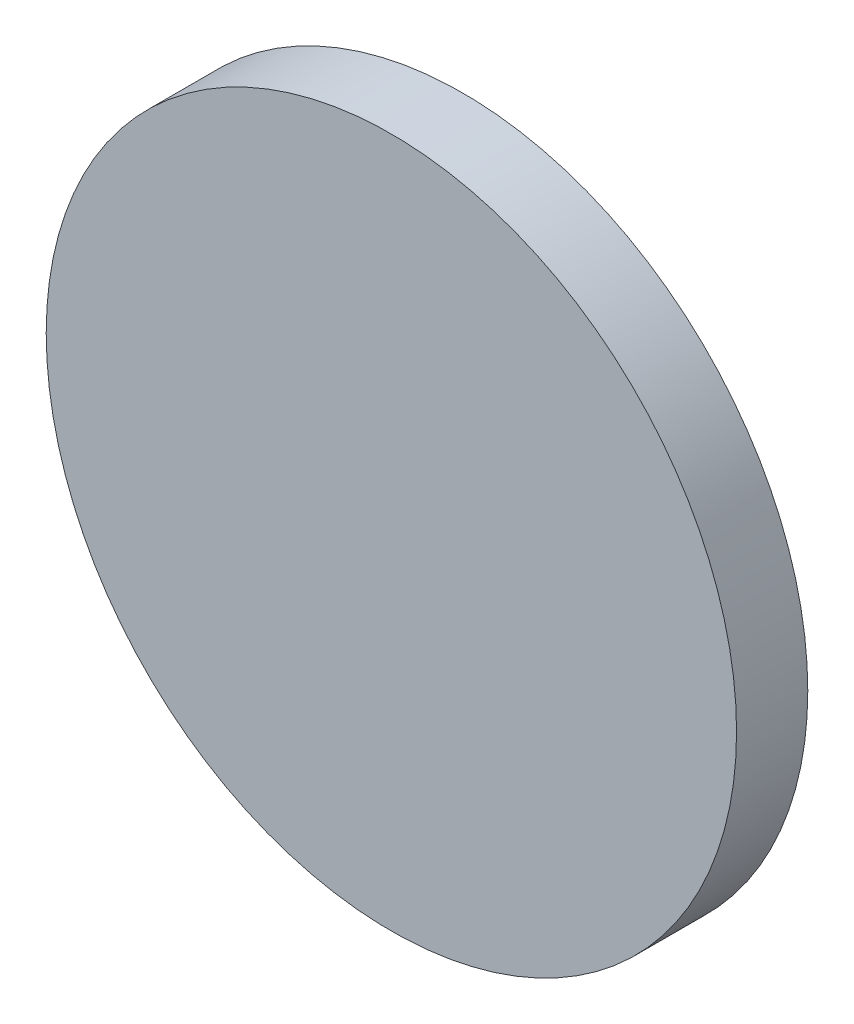
ISO-10303-21;
HEADER;
FILE_DESCRIPTION(('STEP AP214'),'2;1');
FILE_NAME('part.step','',(''),(''),'','','');
FILE_SCHEMA(('AUTOMOTIVE_DESIGN { 1 0 10303 214 1 1 1 1 }'));
ENDSEC;
DATA;
#1=APPLICATION_CONTEXT('core data for automotive mechanical design processes');
#2=APPLICATION_PROTOCOL_DEFINITION('international standard','automotive_design',2000,#1);
#3=PRODUCT_CONTEXT('',#1,'mechanical');
#4=PRODUCT('Part','Part','',(#3));
#5=PRODUCT_RELATED_PRODUCT_CATEGORY('part','',(#4));
#6=PRODUCT_DEFINITION_FORMATION('','',#4);
#7=PRODUCT_DEFINITION_CONTEXT('part definition',#1,'design');
#8=PRODUCT_DEFINITION('design','',#6,#7);
#9=PRODUCT_DEFINITION_SHAPE('','',#8);
#10=(LENGTH_UNIT() NAMED_UNIT(*) SI_UNIT(.MILLI.,.METRE.));
#11=(NAMED_UNIT(*) PLANE_ANGLE_UNIT() SI_UNIT($,.RADIAN.));
#12=(NAMED_UNIT(*) SI_UNIT($,.STERADIAN.) SOLID_ANGLE_UNIT());
#13=UNCERTAINTY_MEASURE_WITH_UNIT(LENGTH_MEASURE(1.E-05),#10,'distance_accuracy_value','');
#14=(GEOMETRIC_REPRESENTATION_CONTEXT(3) GLOBAL_UNCERTAINTY_ASSIGNED_CONTEXT((#13)) GLOBAL_UNIT_ASSIGNED_CONTEXT((#10,
#11,#12)) REPRESENTATION_CONTEXT('',''));
#15=CARTESIAN_POINT('',(0.,0.,0.));
#16=DIRECTION('',(0.,0.,1.));
#17=DIRECTION('',(1.,0.,0.));
#18=AXIS2_PLACEMENT_3D('',#15,#16,#17);
#19=CARTESIAN_POINT('',(0.,0.,3.302));
#20=DIRECTION('',(0.,0.,-1.));
#21=DIRECTION('',(-1.,0.,0.));
#22=AXIS2_PLACEMENT_3D('',#19,#20,#21);
#23=CYLINDRICAL_SURFACE('',#22,16.002);
#24=CARTESIAN_POINT('',(0.,0.,3.302));
#25=DIRECTION('',(0.,0.,1.));
#26=DIRECTION('',(1.,0.,0.));
#27=AXIS2_PLACEMENT_3D('',#24,#25,#26);
#28=CIRCLE('',#27,16.002);
#29=CARTESIAN_POINT('',(-16.002,0.,3.302));
#30=VERTEX_POINT('',#29);
#31=EDGE_CURVE('E10',#30,#30,#28,.T.);
#32=CARTESIAN_POINT('',(0.,0.,0.));
#33=DIRECTION('',(0.,0.,1.));
#34=DIRECTION('',(1.,0.,0.));
#35=AXIS2_PLACEMENT_3D('',#32,#33,#34);
#36=CIRCLE('',#35,16.002);
#37=CARTESIAN_POINT('',(-16.002,0.,0.));
#38=VERTEX_POINT('',#37);
#39=EDGE_CURVE('E38',#38,#38,#36,.T.);
#40=CARTESIAN_POINT('',(-16.002,0.,3.302));
#41=CARTESIAN_POINT('',(-16.002,0.,3.26760416666667));
#42=CARTESIAN_POINT('',(-16.002,0.,3.23320833333333));
#43=CARTESIAN_POINT('',(-16.002,0.,3.16441666666667));
#44=CARTESIAN_POINT('',(-16.002,0.,3.13002083333333));
#45=CARTESIAN_POINT('',(-16.002,0.,3.06122916666667));
#46=CARTESIAN_POINT('',(-16.002,0.,3.02683333333333));
#47=CARTESIAN_POINT('',(-16.002,0.,2.95804166666667));
#48=CARTESIAN_POINT('',(-16.002,0.,2.92364583333333));
#49=CARTESIAN_POINT('',(-16.002,0.,2.85485416666667));
#50=CARTESIAN_POINT('',(-16.002,0.,2.82045833333333));
#51=CARTESIAN_POINT('',(-16.002,0.,2.75166666666667));
#52=CARTESIAN_POINT('',(-16.002,0.,2.71727083333333));
#53=CARTESIAN_POINT('',(-16.002,0.,2.64847916666667));
#54=CARTESIAN_POINT('',(-16.002,0.,2.61408333333333));
#55=CARTESIAN_POINT('',(-16.002,0.,2.54529166666667));
#56=CARTESIAN_POINT('',(-16.002,0.,2.51089583333333));
#57=CARTESIAN_POINT('',(-16.002,0.,2.44210416666667));
#58=CARTESIAN_POINT('',(-16.002,0.,2.40770833333333));
#59=CARTESIAN_POINT('',(-16.002,0.,2.33891666666667));
#60=CARTESIAN_POINT('',(-16.002,0.,2.30452083333333));
#61=CARTESIAN_POINT('',(-16.002,0.,2.23572916666667));
#62=CARTESIAN_POINT('',(-16.002,0.,2.20133333333333));
#63=CARTESIAN_POINT('',(-16.002,0.,2.13254166666667));
#64=CARTESIAN_POINT('',(-16.002,0.,2.09814583333333));
#65=CARTESIAN_POINT('',(-16.002,0.,2.02935416666667));
#66=CARTESIAN_POINT('',(-16.002,0.,1.99495833333333));
#67=CARTESIAN_POINT('',(-16.002,0.,1.92616666666667));
#68=CARTESIAN_POINT('',(-16.002,0.,1.89177083333333));
#69=CARTESIAN_POINT('',(-16.002,0.,1.82297916666667));
#70=CARTESIAN_POINT('',(-16.002,0.,1.78858333333333));
#71=CARTESIAN_POINT('',(-16.002,0.,1.71979166666667));
#72=CARTESIAN_POINT('',(-16.002,0.,1.68539583333333));
#73=CARTESIAN_POINT('',(-16.002,0.,1.61660416666667));
#74=CARTESIAN_POINT('',(-16.002,0.,1.58220833333333));
#75=CARTESIAN_POINT('',(-16.002,0.,1.51341666666667));
#76=CARTESIAN_POINT('',(-16.002,0.,1.47902083333333));
#77=CARTESIAN_POINT('',(-16.002,0.,1.41022916666667));
#78=CARTESIAN_POINT('',(-16.002,0.,1.37583333333333));
#79=CARTESIAN_POINT('',(-16.002,0.,1.30704166666667));
#80=CARTESIAN_POINT('',(-16.002,0.,1.27264583333333));
#81=CARTESIAN_POINT('',(-16.002,0.,1.20385416666667));
#82=CARTESIAN_POINT('',(-16.002,0.,1.16945833333333));
#83=CARTESIAN_POINT('',(-16.002,0.,1.10066666666667));
#84=CARTESIAN_POINT('',(-16.002,0.,1.06627083333333));
#85=CARTESIAN_POINT('',(-16.002,0.,0.997479166666666));
#86=CARTESIAN_POINT('',(-16.002,0.,0.963083333333333));
#87=CARTESIAN_POINT('',(-16.002,0.,0.894291666666666));
#88=CARTESIAN_POINT('',(-16.002,0.,0.859895833333333));
#89=CARTESIAN_POINT('',(-16.002,0.,0.791104166666666));
#90=CARTESIAN_POINT('',(-16.002,0.,0.756708333333333));
#91=CARTESIAN_POINT('',(-16.002,0.,0.687916666666667));
#92=CARTESIAN_POINT('',(-16.002,0.,0.653520833333333));
#93=CARTESIAN_POINT('',(-16.002,0.,0.584729166666667));
#94=CARTESIAN_POINT('',(-16.002,0.,0.550333333333333));
#95=CARTESIAN_POINT('',(-16.002,0.,0.481541666666667));
#96=CARTESIAN_POINT('',(-16.002,0.,0.447145833333333));
#97=CARTESIAN_POINT('',(-16.002,0.,0.378354166666667));
#98=CARTESIAN_POINT('',(-16.002,0.,0.343958333333333));
#99=CARTESIAN_POINT('',(-16.002,0.,0.275166666666667));
#100=CARTESIAN_POINT('',(-16.002,0.,0.240770833333333));
#101=CARTESIAN_POINT('',(-16.002,0.,0.171979166666667));
#102=CARTESIAN_POINT('',(-16.002,0.,0.137583333333333));
#103=CARTESIAN_POINT('',(-16.002,0.,0.0687916666666666));
#104=CARTESIAN_POINT('',(-16.002,0.,0.0343958333333333));
#105=CARTESIAN_POINT('',(-16.002,0.,0.));
#106=B_SPLINE_CURVE_WITH_KNOTS('',3,(#40,#41,#42,#43,#44,#45,#46,#47,#48,#49,#50,#51,#52,#53,
#54,#55,#56,#57,#58,#59,#60,#61,#62,#63,#64,#65,#66,#67,#68,#69,#70,#71,#72,#73,#74,#75,#76,#77,
#78,#79,#80,#81,#82,#83,#84,#85,#86,#87,#88,#89,#90,#91,#92,#93,#94,#95,#96,#97,#98,#99,#100,
#101,#102,#103,#104,#105),.UNSPECIFIED.,.F.,.F.,(4,2,2,2,2,2,2,2,2,2,2,2,2,2,2,2,2,2,2,2,2,2,2,
2,2,2,2,2,2,2,2,2,4),(0.,0.1031875,0.206375,0.3095625,0.41275,0.5159375,0.619125,0.7223125,
0.8255,0.9286875,1.031875,1.1350625,1.23825,1.3414375,1.444625,1.5478125,1.651,1.7541875,
1.857375,1.9605625,2.06375,2.1669375,2.270125,2.3733125,2.4765,2.5796875,2.682875,2.7860625,
2.88925,2.9924375,3.095625,3.1988125,3.302),.UNSPECIFIED.);
#107=EDGE_CURVE('BSEAM35',#30,#38,#106,.T.);
#108=ORIENTED_EDGE('',*,*,#31,.F.);
#109=ORIENTED_EDGE('',*,*,#39,.T.);
#110=ORIENTED_EDGE('',*,*,#107,.T.);
#111=ORIENTED_EDGE('',*,*,#107,.F.);
#112=EDGE_LOOP('',(#108,#110,#109,#111));
#113=FACE_BOUND('',#112,.T.);
#114=ADVANCED_FACE('F35',(#113),#23,.T.);
#115=CARTESIAN_POINT('',(0.,0.,3.302));
#116=DIRECTION('',(0.,0.,1.));
#117=DIRECTION('',(1.,0.,0.));
#118=AXIS2_PLACEMENT_3D('',#115,#116,#117);
#119=PLANE('',#118);
#120=ORIENTED_EDGE('',*,*,#31,.T.);
#121=EDGE_LOOP('',(#120));
#122=FACE_BOUND('',#121,.T.);
#123=ADVANCED_FACE('F50',(#122),#119,.T.);
#124=CARTESIAN_POINT('',(0.,0.,0.));
#125=DIRECTION('',(0.,0.,1.));
#126=DIRECTION('',(1.,0.,0.));
#127=AXIS2_PLACEMENT_3D('',#124,#125,#126);
#128=PLANE('',#127);
#129=ORIENTED_EDGE('',*,*,#39,.F.);
#130=EDGE_LOOP('',(#129));
#131=FACE_BOUND('',#130,.T.);
#132=ADVANCED_FACE('F48',(#131),#128,.F.);
#133=CLOSED_SHELL('',(#114,#123,#132));
#134=MANIFOLD_SOLID_BREP('B2',#133);
#135=ADVANCED_BREP_SHAPE_REPRESENTATION('',(#18,#134),#14);
#136=SHAPE_DEFINITION_REPRESENTATION(#9,#135);
ENDSEC;
END-ISO-10303-21;
